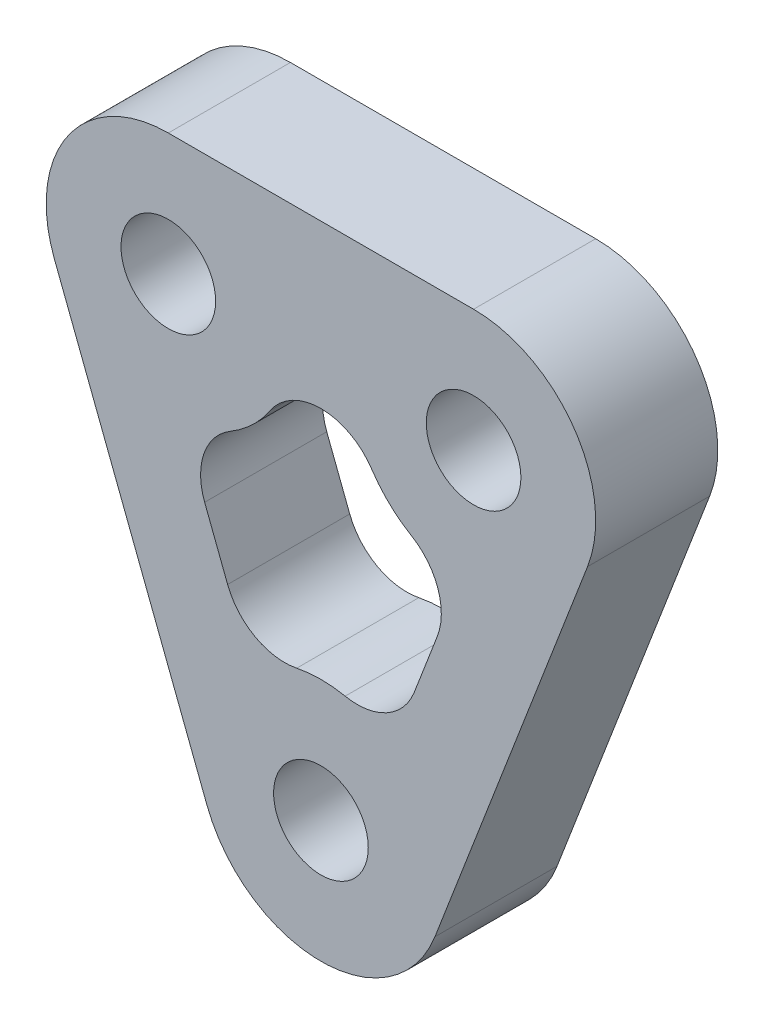
ISO-10303-21;
HEADER;
FILE_DESCRIPTION(('STEP AP214'),'2;1');
FILE_NAME('part.step','',(''),(''),'','','');
FILE_SCHEMA(('AUTOMOTIVE_DESIGN { 1 0 10303 214 1 1 1 1 }'));
ENDSEC;
DATA;
#1=APPLICATION_CONTEXT('core data for automotive mechanical design processes');
#2=APPLICATION_PROTOCOL_DEFINITION('international standard','automotive_design',2000,#1);
#3=PRODUCT_CONTEXT('',#1,'mechanical');
#4=PRODUCT('Part','Part','',(#3));
#5=PRODUCT_RELATED_PRODUCT_CATEGORY('part','',(#4));
#6=PRODUCT_DEFINITION_FORMATION('','',#4);
#7=PRODUCT_DEFINITION_CONTEXT('part definition',#1,'design');
#8=PRODUCT_DEFINITION('design','',#6,#7);
#9=PRODUCT_DEFINITION_SHAPE('','',#8);
#10=(LENGTH_UNIT() NAMED_UNIT(*) SI_UNIT(.MILLI.,.METRE.));
#11=(NAMED_UNIT(*) PLANE_ANGLE_UNIT() SI_UNIT($,.RADIAN.));
#12=(NAMED_UNIT(*) SI_UNIT($,.STERADIAN.) SOLID_ANGLE_UNIT());
#13=UNCERTAINTY_MEASURE_WITH_UNIT(LENGTH_MEASURE(1.E-05),#10,'distance_accuracy_value','');
#14=(GEOMETRIC_REPRESENTATION_CONTEXT(3) GLOBAL_UNCERTAINTY_ASSIGNED_CONTEXT((#13)) GLOBAL_UNIT_ASSIGNED_CONTEXT((#10,
#11,#12)) REPRESENTATION_CONTEXT('',''));
#15=CARTESIAN_POINT('',(0.,0.,0.));
#16=DIRECTION('',(0.,0.,1.));
#17=DIRECTION('',(1.,0.,0.));
#18=AXIS2_PLACEMENT_3D('',#15,#16,#17);
#19=CARTESIAN_POINT('',(-5.,13.,4.));
#20=DIRECTION('',(0.,0.,-1.));
#21=DIRECTION('',(-1.,0.,0.));
#22=AXIS2_PLACEMENT_3D('',#19,#20,#21);
#23=CYLINDRICAL_SURFACE('',#22,4.);
#24=CARTESIAN_POINT('',(-5.,13.,0.));
#25=DIRECTION('',(0.,0.,1.));
#26=DIRECTION('',(1.,0.,0.));
#27=AXIS2_PLACEMENT_3D('',#24,#25,#26);
#28=CIRCLE('',#27,4.);
#29=CARTESIAN_POINT('',(-2.96193701342802,9.55815467187073,0.));
#30=VERTEX_POINT('',#29);
#31=CARTESIAN_POINT('',(-1.66666666666667,10.7889168064297,0.));
#32=VERTEX_POINT('',#31);
#33=EDGE_CURVE('E232',#30,#32,#28,.T.);
#34=ORIENTED_EDGE('',*,*,#33,.T.);
#35=DIRECTION('',(0.,0.,-1.));
#36=VECTOR('',#35,1.);
#37=CARTESIAN_POINT('',(-1.66666666666667,10.7889168064297,4.));
#38=LINE('',#37,#36);
#39=CARTESIAN_POINT('',(-1.66666666666667,10.7889168064297,4.));
#40=VERTEX_POINT('',#39);
#41=EDGE_CURVE('E63',#32,#40,#38,.F.);
#42=ORIENTED_EDGE('',*,*,#41,.T.);
#43=CARTESIAN_POINT('',(-5.,13.,4.));
#44=DIRECTION('',(0.,0.,1.));
#45=DIRECTION('',(1.,0.,0.));
#46=AXIS2_PLACEMENT_3D('',#43,#44,#45);
#47=CIRCLE('',#46,4.);
#48=CARTESIAN_POINT('',(-2.96193701342802,9.55815467187073,4.));
#49=VERTEX_POINT('',#48);
#50=EDGE_CURVE('E178',#49,#40,#47,.T.);
#51=ORIENTED_EDGE('',*,*,#50,.F.);
#52=DIRECTION('',(0.,0.,-1.));
#53=VECTOR('',#52,1.);
#54=CARTESIAN_POINT('',(-2.96193701342802,9.55815467187073,4.));
#55=LINE('',#54,#53);
#56=EDGE_CURVE('E166',#49,#30,#55,.T.);
#57=ORIENTED_EDGE('',*,*,#56,.T.);
#58=EDGE_LOOP('',(#34,#42,#51,#57));
#59=FACE_BOUND('',#58,.T.);
#60=ADVANCED_FACE('F41',(#59),#23,.T.);
#61=CARTESIAN_POINT('',(5.,13.,4.));
#62=DIRECTION('',(0.,0.,-1.));
#63=DIRECTION('',(-1.,0.,0.));
#64=AXIS2_PLACEMENT_3D('',#61,#62,#63);
#65=CYLINDRICAL_SURFACE('',#64,4.);
#66=CARTESIAN_POINT('',(5.,13.,4.));
#67=DIRECTION('',(0.,0.,1.));
#68=DIRECTION('',(1.,0.,0.));
#69=AXIS2_PLACEMENT_3D('',#66,#67,#68);
#70=CIRCLE('',#69,4.);
#71=CARTESIAN_POINT('',(2.96193701342802,9.55815467187073,4.));
#72=VERTEX_POINT('',#71);
#73=CARTESIAN_POINT('',(1.66666666666667,10.7889168064297,4.));
#74=VERTEX_POINT('',#73);
#75=EDGE_CURVE('E205',#72,#74,#70,.F.);
#76=ORIENTED_EDGE('',*,*,#75,.T.);
#77=DIRECTION('',(0.,0.,-1.));
#78=VECTOR('',#77,1.);
#79=CARTESIAN_POINT('',(1.66666666666667,10.7889168064297,4.));
#80=LINE('',#79,#78);
#81=CARTESIAN_POINT('',(1.66666666666667,10.7889168064297,0.));
#82=VERTEX_POINT('',#81);
#83=EDGE_CURVE('E329',#74,#82,#80,.T.);
#84=ORIENTED_EDGE('',*,*,#83,.T.);
#85=CARTESIAN_POINT('',(5.,13.,0.));
#86=DIRECTION('',(0.,0.,1.));
#87=DIRECTION('',(1.,0.,0.));
#88=AXIS2_PLACEMENT_3D('',#85,#86,#87);
#89=CIRCLE('',#88,4.);
#90=CARTESIAN_POINT('',(2.96193701342802,9.55815467187073,0.));
#91=VERTEX_POINT('',#90);
#92=EDGE_CURVE('E249',#91,#82,#89,.F.);
#93=ORIENTED_EDGE('',*,*,#92,.F.);
#94=DIRECTION('',(0.,0.,-1.));
#95=VECTOR('',#94,1.);
#96=CARTESIAN_POINT('',(2.96193701342802,9.55815467187073,4.));
#97=LINE('',#96,#95);
#98=EDGE_CURVE('E302',#91,#72,#97,.F.);
#99=ORIENTED_EDGE('',*,*,#98,.T.);
#100=EDGE_LOOP('',(#76,#84,#93,#99));
#101=FACE_BOUND('',#100,.T.);
#102=ADVANCED_FACE('F351',(#101),#65,.T.);
#103=CARTESIAN_POINT('',(0.933345606203059,-0.358979079308869,4.));
#104=DIRECTION('',(0.933345606203059,-0.358979079308869,0.));
#105=DIRECTION('',(0.358979079308869,0.93334560620306,0.));
#106=AXIS2_PLACEMENT_3D('',#103,#104,#105);
#107=PLANE('',#106);
#108=DIRECTION('',(-0.358979079308869,-0.93334560620306,0.));
#109=VECTOR('',#108,1.);
#110=CARTESIAN_POINT('',(0.933345606203059,-0.358979079308869,0.));
#111=LINE('',#110,#109);
#112=CARTESIAN_POINT('',(3.80959673254815,7.11927384918835,0.));
#113=VERTEX_POINT('',#112);
#114=CARTESIAN_POINT('',(3.05709447985797,5.16276799219391,0.));
#115=VERTEX_POINT('',#114);
#116=EDGE_CURVE('E253',#113,#115,#111,.T.);
#117=ORIENTED_EDGE('',*,*,#116,.T.);
#118=DIRECTION('',(0.,0.,1.));
#119=VECTOR('',#118,1.);
#120=CARTESIAN_POINT('',(3.05709447985797,5.16276799219391,4.));
#121=LINE('',#120,#119);
#122=CARTESIAN_POINT('',(3.05709447985797,5.16276799219391,4.));
#123=VERTEX_POINT('',#122);
#124=EDGE_CURVE('E299',#115,#123,#121,.T.);
#125=ORIENTED_EDGE('',*,*,#124,.T.);
#126=DIRECTION('',(-0.358979079308869,-0.93334560620306,0.));
#127=VECTOR('',#126,1.);
#128=CARTESIAN_POINT('',(0.933345606203059,-0.358979079308869,4.));
#129=LINE('',#128,#127);
#130=CARTESIAN_POINT('',(3.80959673254815,7.11927384918835,4.));
#131=VERTEX_POINT('',#130);
#132=EDGE_CURVE('E209',#131,#123,#129,.T.);
#133=ORIENTED_EDGE('',*,*,#132,.F.);
#134=DIRECTION('',(0.,0.,-1.));
#135=VECTOR('',#134,1.);
#136=CARTESIAN_POINT('',(3.80959673254815,7.11927384918836,4.));
#137=LINE('',#136,#135);
#138=EDGE_CURVE('E295',#131,#113,#137,.T.);
#139=ORIENTED_EDGE('',*,*,#138,.T.);
#140=EDGE_LOOP('',(#117,#125,#133,#139));
#141=FACE_BOUND('',#140,.T.);
#142=ADVANCED_FACE('F383',(#141),#107,.F.);
#143=CARTESIAN_POINT('',(0.,0.,4.));
#144=DIRECTION('',(0.,0.,-1.));
#145=DIRECTION('',(-1.,0.,0.));
#146=AXIS2_PLACEMENT_3D('',#143,#144,#145);
#147=CYLINDRICAL_SURFACE('',#146,4.);
#148=CARTESIAN_POINT('',(0.,0.,0.));
#149=DIRECTION('',(0.,0.,1.));
#150=DIRECTION('',(1.,0.,0.));
#151=AXIS2_PLACEMENT_3D('',#148,#149,#150);
#152=CIRCLE('',#151,4.);
#153=CARTESIAN_POINT('',(0.793602178301237,3.9204841005411,0.));
#154=VERTEX_POINT('',#153);
#155=CARTESIAN_POINT('',(-0.793602178301237,3.9204841005411,0.));
#156=VERTEX_POINT('',#155);
#157=EDGE_CURVE('E240',#154,#156,#152,.T.);
#158=ORIENTED_EDGE('',*,*,#157,.T.);
#159=DIRECTION('',(0.,0.,-1.));
#160=VECTOR('',#159,1.);
#161=CARTESIAN_POINT('',(-0.793602178301237,3.9204841005411,4.));
#162=LINE('',#161,#160);
#163=CARTESIAN_POINT('',(-0.793602178301237,3.9204841005411,4.));
#164=VERTEX_POINT('',#163);
#165=EDGE_CURVE('E292',#156,#164,#162,.F.);
#166=ORIENTED_EDGE('',*,*,#165,.T.);
#167=CARTESIAN_POINT('',(0.,0.,4.));
#168=DIRECTION('',(0.,0.,1.));
#169=DIRECTION('',(1.,0.,0.));
#170=AXIS2_PLACEMENT_3D('',#167,#168,#169);
#171=CIRCLE('',#170,4.);
#172=CARTESIAN_POINT('',(0.793602178301237,3.9204841005411,4.));
#173=VERTEX_POINT('',#172);
#174=EDGE_CURVE('E198',#173,#164,#171,.T.);
#175=ORIENTED_EDGE('',*,*,#174,.F.);
#176=DIRECTION('',(0.,0.,-1.));
#177=VECTOR('',#176,1.);
#178=CARTESIAN_POINT('',(0.793602178301237,3.9204841005411,4.));
#179=LINE('',#178,#177);
#180=EDGE_CURVE('E288',#173,#154,#179,.T.);
#181=ORIENTED_EDGE('',*,*,#180,.T.);
#182=EDGE_LOOP('',(#158,#166,#175,#181));
#183=FACE_BOUND('',#182,.T.);
#184=ADVANCED_FACE('F396',(#183),#147,.T.);
#185=CARTESIAN_POINT('',(0.,17.,4.));
#186=DIRECTION('',(0.,1.,0.));
#187=DIRECTION('',(0.,0.,1.));
#188=AXIS2_PLACEMENT_3D('',#185,#186,#187);
#189=PLANE('',#188);
#190=DIRECTION('',(1.,0.,0.));
#191=VECTOR('',#190,1.);
#192=CARTESIAN_POINT('',(0.,17.,0.));
#193=LINE('',#192,#191);
#194=CARTESIAN_POINT('',(-5.,17.,0.));
#195=VERTEX_POINT('',#194);
#196=CARTESIAN_POINT('',(5.,17.,0.));
#197=VERTEX_POINT('',#196);
#198=EDGE_CURVE('E162',#195,#197,#193,.T.);
#199=ORIENTED_EDGE('',*,*,#198,.F.);
#200=DIRECTION('',(0.,0.,-1.));
#201=VECTOR('',#200,1.);
#202=CARTESIAN_POINT('',(-5.,17.,4.));
#203=LINE('',#202,#201);
#204=CARTESIAN_POINT('',(-5.,17.,4.));
#205=VERTEX_POINT('',#204);
#206=EDGE_CURVE('E155',#205,#195,#203,.T.);
#207=ORIENTED_EDGE('',*,*,#206,.F.);
#208=DIRECTION('',(1.,0.,0.));
#209=VECTOR('',#208,1.);
#210=CARTESIAN_POINT('',(0.,17.,4.));
#211=LINE('',#210,#209);
#212=CARTESIAN_POINT('',(5.,17.,4.));
#213=VERTEX_POINT('',#212);
#214=EDGE_CURVE('E159',#205,#213,#211,.T.);
#215=ORIENTED_EDGE('',*,*,#214,.T.);
#216=DIRECTION('',(0.,0.,-1.));
#217=VECTOR('',#216,1.);
#218=CARTESIAN_POINT('',(5.,17.,4.));
#219=LINE('',#218,#217);
#220=EDGE_CURVE('E225',#213,#197,#219,.T.);
#221=ORIENTED_EDGE('',*,*,#220,.T.);
#222=EDGE_LOOP('',(#199,#207,#215,#221));
#223=FACE_BOUND('',#222,.T.);
#224=ADVANCED_FACE('F157',(#223),#189,.T.);
#225=CARTESIAN_POINT('',(-8.73338242481224,11.5640836827645,0.));
#226=VERTEX_POINT('',#225);
#227=EDGE_CURVE('E228',#195,#226,#28,.T.);
#228=ORIENTED_EDGE('',*,*,#227,.T.);
#229=DIRECTION('',(0.,0.,-1.));
#230=VECTOR('',#229,1.);
#231=CARTESIAN_POINT('',(-8.73338242481224,11.5640836827645,4.));
#232=LINE('',#231,#230);
#233=CARTESIAN_POINT('',(-8.73338242481224,11.5640836827645,4.));
#234=VERTEX_POINT('',#233);
#235=EDGE_CURVE('E167',#234,#226,#232,.T.);
#236=ORIENTED_EDGE('',*,*,#235,.F.);
#237=EDGE_CURVE('E170',#205,#234,#47,.T.);
#238=ORIENTED_EDGE('',*,*,#237,.F.);
#239=ORIENTED_EDGE('',*,*,#206,.T.);
#240=EDGE_LOOP('',(#228,#236,#238,#239));
#241=FACE_BOUND('',#240,.T.);
#242=ADVANCED_FACE('F171',(#241),#23,.T.);
#243=CARTESIAN_POINT('',(-3.73338242481224,-1.43591631723548,4.));
#244=DIRECTION('',(0.93334560620306,0.358979079308869,0.));
#245=DIRECTION('',(-0.358979079308869,0.93334560620306,0.));
#246=AXIS2_PLACEMENT_3D('',#243,#244,#245);
#247=PLANE('',#246);
#248=DIRECTION('',(0.358979079308869,-0.93334560620306,0.));
#249=VECTOR('',#248,1.);
#250=CARTESIAN_POINT('',(-3.73338242481224,-1.43591631723548,0.));
#251=LINE('',#250,#249);
#252=CARTESIAN_POINT('',(-3.73338242481224,-1.43591631723548,0.));
#253=VERTEX_POINT('',#252);
#254=EDGE_CURVE('E231',#226,#253,#251,.T.);
#255=ORIENTED_EDGE('',*,*,#254,.T.);
#256=DIRECTION('',(0.,0.,-1.));
#257=VECTOR('',#256,1.);
#258=CARTESIAN_POINT('',(-3.73338242481224,-1.43591631723548,4.));
#259=LINE('',#258,#257);
#260=CARTESIAN_POINT('',(-3.73338242481224,-1.43591631723548,4.));
#261=VERTEX_POINT('',#260);
#262=EDGE_CURVE('E272',#261,#253,#259,.T.);
#263=ORIENTED_EDGE('',*,*,#262,.F.);
#264=DIRECTION('',(0.358979079308869,-0.93334560620306,0.));
#265=VECTOR('',#264,1.);
#266=CARTESIAN_POINT('',(-3.73338242481224,-1.43591631723548,4.));
#267=LINE('',#266,#265);
#268=EDGE_CURVE('E176',#234,#261,#267,.T.);
#269=ORIENTED_EDGE('',*,*,#268,.F.);
#270=ORIENTED_EDGE('',*,*,#235,.T.);
#271=EDGE_LOOP('',(#255,#263,#269,#270));
#272=FACE_BOUND('',#271,.T.);
#273=ADVANCED_FACE('F388',(#272),#247,.F.);
#274=CARTESIAN_POINT('',(3.73338242481224,-1.43591631723548,0.));
#275=VERTEX_POINT('',#274);
#276=EDGE_CURVE('E235',#253,#275,#152,.T.);
#277=ORIENTED_EDGE('',*,*,#276,.T.);
#278=DIRECTION('',(0.,0.,-1.));
#279=VECTOR('',#278,1.);
#280=CARTESIAN_POINT('',(3.73338242481224,-1.43591631723548,4.));
#281=LINE('',#280,#279);
#282=CARTESIAN_POINT('',(3.73338242481224,-1.43591631723548,4.));
#283=VERTEX_POINT('',#282);
#284=EDGE_CURVE('E269',#283,#275,#281,.T.);
#285=ORIENTED_EDGE('',*,*,#284,.F.);
#286=EDGE_CURVE('E194',#261,#283,#171,.T.);
#287=ORIENTED_EDGE('',*,*,#286,.F.);
#288=ORIENTED_EDGE('',*,*,#262,.T.);
#289=EDGE_LOOP('',(#277,#285,#287,#288));
#290=FACE_BOUND('',#289,.T.);
#291=ADVANCED_FACE('F393',(#290),#147,.T.);
#292=CARTESIAN_POINT('',(3.73338242481224,-1.43591631723548,4.));
#293=DIRECTION('',(0.93334560620306,-0.358979079308869,0.));
#294=DIRECTION('',(0.358979079308869,0.93334560620306,0.));
#295=AXIS2_PLACEMENT_3D('',#292,#293,#294);
#296=PLANE('',#295);
#297=DIRECTION('',(-0.358979079308869,-0.93334560620306,0.));
#298=VECTOR('',#297,1.);
#299=CARTESIAN_POINT('',(3.73338242481224,-1.43591631723548,0.));
#300=LINE('',#299,#298);
#301=CARTESIAN_POINT('',(8.73338242481224,11.5640836827645,0.));
#302=VERTEX_POINT('',#301);
#303=EDGE_CURVE('E239',#302,#275,#300,.T.);
#304=ORIENTED_EDGE('',*,*,#303,.F.);
#305=DIRECTION('',(0.,0.,-1.));
#306=VECTOR('',#305,1.);
#307=CARTESIAN_POINT('',(8.73338242481224,11.5640836827645,4.));
#308=LINE('',#307,#306);
#309=CARTESIAN_POINT('',(8.73338242481224,11.5640836827645,4.));
#310=VERTEX_POINT('',#309);
#311=EDGE_CURVE('E266',#310,#302,#308,.T.);
#312=ORIENTED_EDGE('',*,*,#311,.F.);
#313=DIRECTION('',(-0.358979079308869,-0.93334560620306,0.));
#314=VECTOR('',#313,1.);
#315=CARTESIAN_POINT('',(3.73338242481224,-1.43591631723548,4.));
#316=LINE('',#315,#314);
#317=EDGE_CURVE('E197',#310,#283,#316,.T.);
#318=ORIENTED_EDGE('',*,*,#317,.T.);
#319=ORIENTED_EDGE('',*,*,#284,.T.);
#320=EDGE_LOOP('',(#304,#312,#318,#319));
#321=FACE_BOUND('',#320,.T.);
#322=ADVANCED_FACE('F403',(#321),#296,.T.);
#323=CARTESIAN_POINT('',(5.,13.,4.));
#324=DIRECTION('',(0.,0.,-1.));
#325=DIRECTION('',(-1.,0.,0.));
#326=AXIS2_PLACEMENT_3D('',#323,#324,#325);
#327=CYLINDRICAL_SURFACE('',#326,1.55);
#328=CARTESIAN_POINT('',(5.,13.,4.));
#329=DIRECTION('',(0.,0.,1.));
#330=DIRECTION('',(1.,0.,0.));
#331=AXIS2_PLACEMENT_3D('',#328,#329,#330);
#332=CIRCLE('',#331,1.55);
#333=CARTESIAN_POINT('',(6.55,13.,4.));
#334=VERTEX_POINT('',#333);
#335=EDGE_CURVE('E217',#334,#334,#332,.F.);
#336=ORIENTED_EDGE('',*,*,#335,.F.);
#337=EDGE_LOOP('',(#336));
#338=FACE_BOUND('',#337,.T.);
#339=CARTESIAN_POINT('',(5.,13.,0.));
#340=DIRECTION('',(0.,0.,1.));
#341=DIRECTION('',(1.,0.,0.));
#342=AXIS2_PLACEMENT_3D('',#339,#340,#341);
#343=CIRCLE('',#342,1.55);
#344=CARTESIAN_POINT('',(6.55,13.,0.));
#345=VERTEX_POINT('',#344);
#346=EDGE_CURVE('E189',#345,#345,#343,.F.);
#347=ORIENTED_EDGE('',*,*,#346,.T.);
#348=EDGE_LOOP('',(#347));
#349=FACE_BOUND('',#348,.T.);
#350=ADVANCED_FACE('F405',(#338,#349),#327,.F.);
#351=CARTESIAN_POINT('',(-0.933345606203059,-0.358979079308869,4.));
#352=DIRECTION('',(0.933345606203059,0.358979079308869,0.));
#353=DIRECTION('',(-0.358979079308869,0.93334560620306,0.));
#354=AXIS2_PLACEMENT_3D('',#351,#352,#353);
#355=PLANE('',#354);
#356=DIRECTION('',(0.358979079308869,-0.93334560620306,0.));
#357=VECTOR('',#356,1.);
#358=CARTESIAN_POINT('',(-0.933345606203059,-0.358979079308869,0.));
#359=LINE('',#358,#357);
#360=CARTESIAN_POINT('',(-3.80959673254815,7.11927384918835,0.));
#361=VERTEX_POINT('',#360);
#362=CARTESIAN_POINT('',(-3.05709447985797,5.16276799219391,0.));
#363=VERTEX_POINT('',#362);
#364=EDGE_CURVE('E257',#361,#363,#359,.T.);
#365=ORIENTED_EDGE('',*,*,#364,.F.);
#366=DIRECTION('',(0.,0.,-1.));
#367=VECTOR('',#366,1.);
#368=CARTESIAN_POINT('',(-3.80959673254815,7.11927384918836,4.));
#369=LINE('',#368,#367);
#370=CARTESIAN_POINT('',(-3.80959673254815,7.11927384918835,4.));
#371=VERTEX_POINT('',#370);
#372=EDGE_CURVE('E285',#361,#371,#369,.F.);
#373=ORIENTED_EDGE('',*,*,#372,.T.);
#374=DIRECTION('',(0.358979079308869,-0.93334560620306,0.));
#375=VECTOR('',#374,1.);
#376=CARTESIAN_POINT('',(-0.933345606203059,-0.358979079308869,4.));
#377=LINE('',#376,#375);
#378=CARTESIAN_POINT('',(-3.05709447985797,5.16276799219391,4.));
#379=VERTEX_POINT('',#378);
#380=EDGE_CURVE('E213',#371,#379,#377,.T.);
#381=ORIENTED_EDGE('',*,*,#380,.T.);
#382=DIRECTION('',(0.,0.,-1.));
#383=VECTOR('',#382,1.);
#384=CARTESIAN_POINT('',(-3.05709447985797,5.16276799219391,4.));
#385=LINE('',#384,#383);
#386=EDGE_CURVE('E281',#379,#363,#385,.T.);
#387=ORIENTED_EDGE('',*,*,#386,.T.);
#388=EDGE_LOOP('',(#365,#373,#381,#387));
#389=FACE_BOUND('',#388,.T.);
#390=ADVANCED_FACE('F362',(#389),#355,.T.);
#391=CARTESIAN_POINT('',(0.,0.,4.));
#392=DIRECTION('',(0.,0.,-1.));
#393=DIRECTION('',(-1.,0.,0.));
#394=AXIS2_PLACEMENT_3D('',#391,#392,#393);
#395=CYLINDRICAL_SURFACE('',#394,1.55);
#396=CARTESIAN_POINT('',(0.,0.,4.));
#397=DIRECTION('',(0.,0.,1.));
#398=DIRECTION('',(1.,0.,0.));
#399=AXIS2_PLACEMENT_3D('',#396,#397,#398);
#400=CIRCLE('',#399,1.55);
#401=CARTESIAN_POINT('',(1.55,0.,4.));
#402=VERTEX_POINT('',#401);
#403=EDGE_CURVE('E204',#402,#402,#400,.T.);
#404=ORIENTED_EDGE('',*,*,#403,.T.);
#405=EDGE_LOOP('',(#404));
#406=FACE_BOUND('',#405,.T.);
#407=CARTESIAN_POINT('',(0.,0.,0.));
#408=DIRECTION('',(0.,0.,1.));
#409=DIRECTION('',(1.,0.,0.));
#410=AXIS2_PLACEMENT_3D('',#407,#408,#409);
#411=CIRCLE('',#410,1.55);
#412=CARTESIAN_POINT('',(1.55,0.,0.));
#413=VERTEX_POINT('',#412);
#414=EDGE_CURVE('E248',#413,#413,#411,.T.);
#415=ORIENTED_EDGE('',*,*,#414,.F.);
#416=EDGE_LOOP('',(#415));
#417=FACE_BOUND('',#416,.T.);
#418=ADVANCED_FACE('F407',(#406,#417),#395,.F.);
#419=EDGE_CURVE('E244',#197,#302,#89,.F.);
#420=ORIENTED_EDGE('',*,*,#419,.F.);
#421=ORIENTED_EDGE('',*,*,#220,.F.);
#422=EDGE_CURVE('E183',#213,#310,#70,.F.);
#423=ORIENTED_EDGE('',*,*,#422,.T.);
#424=ORIENTED_EDGE('',*,*,#311,.T.);
#425=EDGE_LOOP('',(#420,#421,#423,#424));
#426=FACE_BOUND('',#425,.T.);
#427=ADVANCED_FACE('F385',(#426),#65,.T.);
#428=CARTESIAN_POINT('',(-5.,13.,4.));
#429=DIRECTION('',(0.,0.,-1.));
#430=DIRECTION('',(-1.,0.,0.));
#431=AXIS2_PLACEMENT_3D('',#428,#429,#430);
#432=CYLINDRICAL_SURFACE('',#431,1.55);
#433=CARTESIAN_POINT('',(-5.,13.,4.));
#434=DIRECTION('',(0.,0.,1.));
#435=DIRECTION('',(1.,0.,0.));
#436=AXIS2_PLACEMENT_3D('',#433,#434,#435);
#437=CIRCLE('',#436,1.55);
#438=CARTESIAN_POINT('',(-3.45,13.,4.));
#439=VERTEX_POINT('',#438);
#440=EDGE_CURVE('E221',#439,#439,#437,.T.);
#441=ORIENTED_EDGE('',*,*,#440,.T.);
#442=EDGE_LOOP('',(#441));
#443=FACE_BOUND('',#442,.T.);
#444=CARTESIAN_POINT('',(-5.,13.,0.));
#445=DIRECTION('',(0.,0.,1.));
#446=DIRECTION('',(1.,0.,0.));
#447=AXIS2_PLACEMENT_3D('',#444,#445,#446);
#448=CIRCLE('',#447,1.55);
#449=CARTESIAN_POINT('',(-3.45,13.,0.));
#450=VERTEX_POINT('',#449);
#451=EDGE_CURVE('E185',#450,#450,#448,.T.);
#452=ORIENTED_EDGE('',*,*,#451,.F.);
#453=EDGE_LOOP('',(#452));
#454=FACE_BOUND('',#453,.T.);
#455=ADVANCED_FACE('F414',(#443,#454),#432,.F.);
#456=CARTESIAN_POINT('',(0.,0.,4.));
#457=DIRECTION('',(0.,0.,1.));
#458=DIRECTION('',(1.,0.,0.));
#459=AXIS2_PLACEMENT_3D('',#456,#457,#458);
#460=PLANE('',#459);
#461=ORIENTED_EDGE('',*,*,#214,.F.);
#462=ORIENTED_EDGE('',*,*,#237,.T.);
#463=ORIENTED_EDGE('',*,*,#268,.T.);
#464=ORIENTED_EDGE('',*,*,#286,.T.);
#465=ORIENTED_EDGE('',*,*,#317,.F.);
#466=ORIENTED_EDGE('',*,*,#422,.F.);
#467=EDGE_LOOP('',(#461,#462,#463,#464,#465,#466));
#468=FACE_BOUND('',#467,.T.);
#469=ORIENTED_EDGE('',*,*,#403,.F.);
#470=EDGE_LOOP('',(#469));
#471=FACE_BOUND('',#470,.T.);
#472=ORIENTED_EDGE('',*,*,#380,.F.);
#473=CARTESIAN_POINT('',(-1.94290552014203,7.83723200780609,4.));
#474=DIRECTION('',(0.,0.,1.));
#475=DIRECTION('',(1.,0.,0.));
#476=AXIS2_PLACEMENT_3D('',#473,#474,#475);
#477=CIRCLE('',#476,2.);
#478=EDGE_CURVE('E308',#371,#49,#477,.F.);
#479=ORIENTED_EDGE('',*,*,#478,.T.);
#480=ORIENTED_EDGE('',*,*,#50,.T.);
#481=CARTESIAN_POINT('',(0.,9.6833752096446,4.));
#482=DIRECTION('',(0.,0.,1.));
#483=DIRECTION('',(1.,0.,0.));
#484=AXIS2_PLACEMENT_3D('',#481,#482,#483);
#485=CIRCLE('',#484,2.);
#486=EDGE_CURVE('E11',#40,#74,#485,.F.);
#487=ORIENTED_EDGE('',*,*,#486,.T.);
#488=ORIENTED_EDGE('',*,*,#75,.F.);
#489=CARTESIAN_POINT('',(1.94290552014203,7.83723200780609,4.));
#490=DIRECTION('',(0.,0.,1.));
#491=DIRECTION('',(1.,0.,0.));
#492=AXIS2_PLACEMENT_3D('',#489,#490,#491);
#493=CIRCLE('',#492,2.);
#494=EDGE_CURVE('E326',#72,#131,#493,.F.);
#495=ORIENTED_EDGE('',*,*,#494,.T.);
#496=ORIENTED_EDGE('',*,*,#132,.T.);
#497=CARTESIAN_POINT('',(1.19040326745186,5.88072615081165,4.));
#498=DIRECTION('',(0.,0.,1.));
#499=DIRECTION('',(1.,0.,0.));
#500=AXIS2_PLACEMENT_3D('',#497,#498,#499);
#501=CIRCLE('',#500,2.);
#502=EDGE_CURVE('E320',#123,#173,#501,.F.);
#503=ORIENTED_EDGE('',*,*,#502,.T.);
#504=ORIENTED_EDGE('',*,*,#174,.T.);
#505=CARTESIAN_POINT('',(-1.19040326745186,5.88072615081165,4.));
#506=DIRECTION('',(0.,0.,1.));
#507=DIRECTION('',(1.,0.,0.));
#508=AXIS2_PLACEMENT_3D('',#505,#506,#507);
#509=CIRCLE('',#508,2.);
#510=EDGE_CURVE('E314',#164,#379,#509,.F.);
#511=ORIENTED_EDGE('',*,*,#510,.T.);
#512=EDGE_LOOP('',(#472,#479,#480,#487,#488,#495,#496,#503,#504,#511));
#513=FACE_BOUND('',#512,.T.);
#514=ORIENTED_EDGE('',*,*,#335,.T.);
#515=EDGE_LOOP('',(#514));
#516=FACE_BOUND('',#515,.T.);
#517=ORIENTED_EDGE('',*,*,#440,.F.);
#518=EDGE_LOOP('',(#517));
#519=FACE_BOUND('',#518,.T.);
#520=ADVANCED_FACE('F179',(#468,#471,#513,#516,#519),#460,.T.);
#521=CARTESIAN_POINT('',(0.,0.,0.));
#522=DIRECTION('',(0.,0.,1.));
#523=DIRECTION('',(1.,0.,0.));
#524=AXIS2_PLACEMENT_3D('',#521,#522,#523);
#525=PLANE('',#524);
#526=ORIENTED_EDGE('',*,*,#198,.T.);
#527=ORIENTED_EDGE('',*,*,#419,.T.);
#528=ORIENTED_EDGE('',*,*,#303,.T.);
#529=ORIENTED_EDGE('',*,*,#276,.F.);
#530=ORIENTED_EDGE('',*,*,#254,.F.);
#531=ORIENTED_EDGE('',*,*,#227,.F.);
#532=EDGE_LOOP('',(#526,#527,#528,#529,#530,#531));
#533=FACE_BOUND('',#532,.T.);
#534=ORIENTED_EDGE('',*,*,#414,.T.);
#535=EDGE_LOOP('',(#534));
#536=FACE_BOUND('',#535,.T.);
#537=ORIENTED_EDGE('',*,*,#33,.F.);
#538=CARTESIAN_POINT('',(-1.94290552014203,7.83723200780609,0.));
#539=DIRECTION('',(0.,0.,1.));
#540=DIRECTION('',(1.,0.,0.));
#541=AXIS2_PLACEMENT_3D('',#538,#539,#540);
#542=CIRCLE('',#541,2.);
#543=EDGE_CURVE('E305',#30,#361,#542,.T.);
#544=ORIENTED_EDGE('',*,*,#543,.T.);
#545=ORIENTED_EDGE('',*,*,#364,.T.);
#546=CARTESIAN_POINT('',(-1.19040326745186,5.88072615081165,0.));
#547=DIRECTION('',(0.,0.,1.));
#548=DIRECTION('',(1.,0.,0.));
#549=AXIS2_PLACEMENT_3D('',#546,#547,#548);
#550=CIRCLE('',#549,2.);
#551=EDGE_CURVE('E311',#363,#156,#550,.T.);
#552=ORIENTED_EDGE('',*,*,#551,.T.);
#553=ORIENTED_EDGE('',*,*,#157,.F.);
#554=CARTESIAN_POINT('',(1.19040326745186,5.88072615081165,0.));
#555=DIRECTION('',(0.,0.,1.));
#556=DIRECTION('',(1.,0.,0.));
#557=AXIS2_PLACEMENT_3D('',#554,#555,#556);
#558=CIRCLE('',#557,2.);
#559=EDGE_CURVE('E317',#154,#115,#558,.T.);
#560=ORIENTED_EDGE('',*,*,#559,.T.);
#561=ORIENTED_EDGE('',*,*,#116,.F.);
#562=CARTESIAN_POINT('',(1.94290552014203,7.83723200780609,0.));
#563=DIRECTION('',(0.,0.,1.));
#564=DIRECTION('',(1.,0.,0.));
#565=AXIS2_PLACEMENT_3D('',#562,#563,#564);
#566=CIRCLE('',#565,2.);
#567=EDGE_CURVE('E323',#113,#91,#566,.T.);
#568=ORIENTED_EDGE('',*,*,#567,.T.);
#569=ORIENTED_EDGE('',*,*,#92,.T.);
#570=CARTESIAN_POINT('',(0.,9.6833752096446,0.));
#571=DIRECTION('',(0.,0.,1.));
#572=DIRECTION('',(1.,0.,0.));
#573=AXIS2_PLACEMENT_3D('',#570,#571,#572);
#574=CIRCLE('',#573,2.);
#575=EDGE_CURVE('E50',#82,#32,#574,.T.);
#576=ORIENTED_EDGE('',*,*,#575,.T.);
#577=EDGE_LOOP('',(#537,#544,#545,#552,#553,#560,#561,#568,#569,#576));
#578=FACE_BOUND('',#577,.T.);
#579=ORIENTED_EDGE('',*,*,#346,.F.);
#580=EDGE_LOOP('',(#579));
#581=FACE_BOUND('',#580,.T.);
#582=ORIENTED_EDGE('',*,*,#451,.T.);
#583=EDGE_LOOP('',(#582));
#584=FACE_BOUND('',#583,.T.);
#585=ADVANCED_FACE('F353',(#533,#536,#578,#581,#584),#525,.F.);
#586=CARTESIAN_POINT('',(-1.94290552014203,7.83723200780609,4.));
#587=DIRECTION('',(0.,0.,-1.));
#588=DIRECTION('',(-1.,0.,0.));
#589=AXIS2_PLACEMENT_3D('',#586,#587,#588);
#590=CYLINDRICAL_SURFACE('',#589,2.);
#591=ORIENTED_EDGE('',*,*,#478,.F.);
#592=ORIENTED_EDGE('',*,*,#372,.F.);
#593=ORIENTED_EDGE('',*,*,#543,.F.);
#594=ORIENTED_EDGE('',*,*,#56,.F.);
#595=EDGE_LOOP('',(#591,#592,#593,#594));
#596=FACE_BOUND('',#595,.T.);
#597=ADVANCED_FACE('F364',(#596),#590,.F.);
#598=CARTESIAN_POINT('',(-1.19040326745186,5.88072615081165,4.));
#599=DIRECTION('',(0.,0.,-1.));
#600=DIRECTION('',(-1.,0.,0.));
#601=AXIS2_PLACEMENT_3D('',#598,#599,#600);
#602=CYLINDRICAL_SURFACE('',#601,2.);
#603=ORIENTED_EDGE('',*,*,#510,.F.);
#604=ORIENTED_EDGE('',*,*,#165,.F.);
#605=ORIENTED_EDGE('',*,*,#551,.F.);
#606=ORIENTED_EDGE('',*,*,#386,.F.);
#607=EDGE_LOOP('',(#603,#604,#605,#606));
#608=FACE_BOUND('',#607,.T.);
#609=ADVANCED_FACE('F366',(#608),#602,.F.);
#610=CARTESIAN_POINT('',(1.19040326745186,5.88072615081165,4.));
#611=DIRECTION('',(0.,0.,-1.));
#612=DIRECTION('',(-1.,0.,0.));
#613=AXIS2_PLACEMENT_3D('',#610,#611,#612);
#614=CYLINDRICAL_SURFACE('',#613,2.);
#615=ORIENTED_EDGE('',*,*,#502,.F.);
#616=ORIENTED_EDGE('',*,*,#124,.F.);
#617=ORIENTED_EDGE('',*,*,#559,.F.);
#618=ORIENTED_EDGE('',*,*,#180,.F.);
#619=EDGE_LOOP('',(#615,#616,#617,#618));
#620=FACE_BOUND('',#619,.T.);
#621=ADVANCED_FACE('F372',(#620),#614,.F.);
#622=CARTESIAN_POINT('',(1.94290552014203,7.83723200780609,4.));
#623=DIRECTION('',(0.,0.,-1.));
#624=DIRECTION('',(-1.,0.,0.));
#625=AXIS2_PLACEMENT_3D('',#622,#623,#624);
#626=CYLINDRICAL_SURFACE('',#625,2.);
#627=ORIENTED_EDGE('',*,*,#494,.F.);
#628=ORIENTED_EDGE('',*,*,#98,.F.);
#629=ORIENTED_EDGE('',*,*,#567,.F.);
#630=ORIENTED_EDGE('',*,*,#138,.F.);
#631=EDGE_LOOP('',(#627,#628,#629,#630));
#632=FACE_BOUND('',#631,.T.);
#633=ADVANCED_FACE('F450',(#632),#626,.F.);
#634=CARTESIAN_POINT('',(0.,9.6833752096446,4.));
#635=DIRECTION('',(0.,0.,1.));
#636=DIRECTION('',(1.,0.,0.));
#637=AXIS2_PLACEMENT_3D('',#634,#635,#636);
#638=CYLINDRICAL_SURFACE('',#637,2.);
#639=ORIENTED_EDGE('',*,*,#486,.F.);
#640=ORIENTED_EDGE('',*,*,#41,.F.);
#641=ORIENTED_EDGE('',*,*,#575,.F.);
#642=ORIENTED_EDGE('',*,*,#83,.F.);
#643=EDGE_LOOP('',(#639,#640,#641,#642));
#644=FACE_BOUND('',#643,.T.);
#645=ADVANCED_FACE('F43',(#644),#638,.F.);
#646=CLOSED_SHELL('',(#60,#102,#142,#184,#224,#242,#273,#291,#322,#350,#390,#418,#427,#455,#520,
#585,#597,#609,#621,#633,#645));
#647=MANIFOLD_SOLID_BREP('B2',#646);
#648=ADVANCED_BREP_SHAPE_REPRESENTATION('',(#18,#647),#14);
#649=SHAPE_DEFINITION_REPRESENTATION(#9,#648);
ENDSEC;
END-ISO-10303-21;
